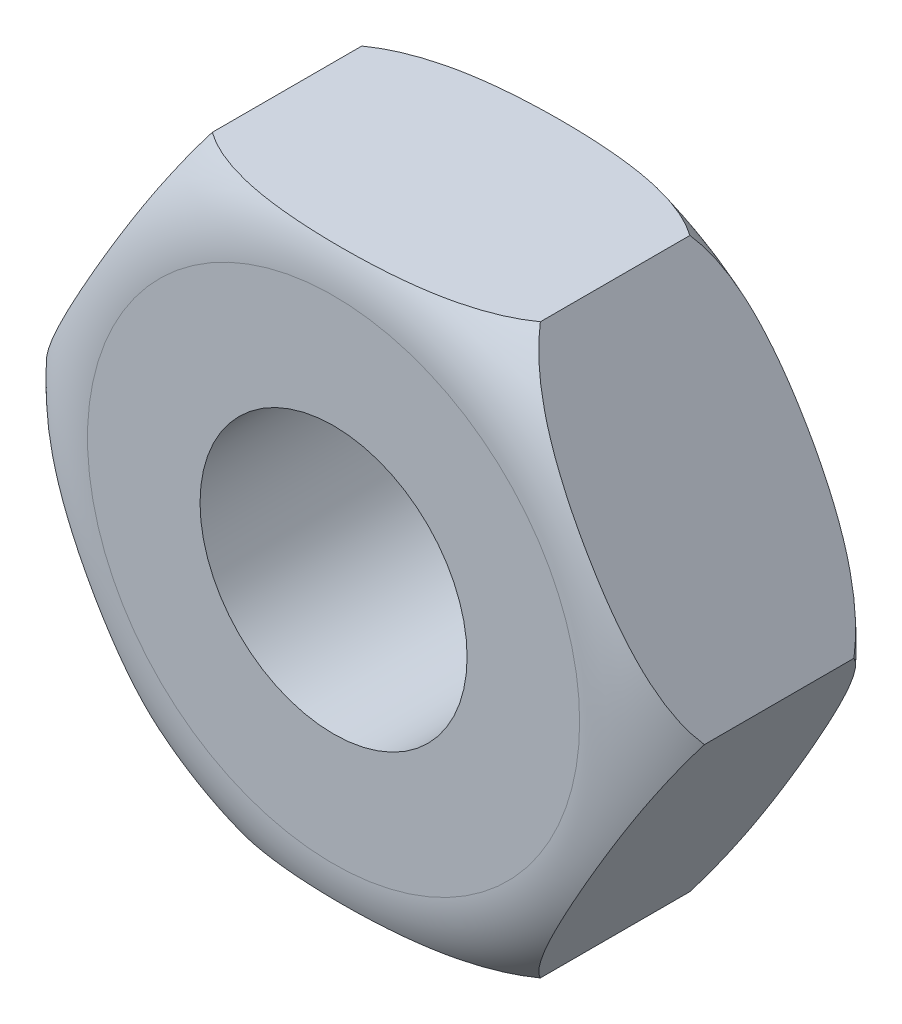
ISO-10303-21;
HEADER;
FILE_DESCRIPTION(('STEP AP214'),'2;1');
FILE_NAME('part.step','',(''),(''),'','','');
FILE_SCHEMA(('AUTOMOTIVE_DESIGN { 1 0 10303 214 1 1 1 1 }'));
ENDSEC;
DATA;
#1=APPLICATION_CONTEXT('core data for automotive mechanical design processes');
#2=APPLICATION_PROTOCOL_DEFINITION('international standard','automotive_design',2000,#1);
#3=PRODUCT_CONTEXT('',#1,'mechanical');
#4=PRODUCT('Part','Part','',(#3));
#5=PRODUCT_RELATED_PRODUCT_CATEGORY('part','',(#4));
#6=PRODUCT_DEFINITION_FORMATION('','',#4);
#7=PRODUCT_DEFINITION_CONTEXT('part definition',#1,'design');
#8=PRODUCT_DEFINITION('design','',#6,#7);
#9=PRODUCT_DEFINITION_SHAPE('','',#8);
#10=(LENGTH_UNIT() NAMED_UNIT(*) SI_UNIT(.MILLI.,.METRE.));
#11=(NAMED_UNIT(*) PLANE_ANGLE_UNIT() SI_UNIT($,.RADIAN.));
#12=(NAMED_UNIT(*) SI_UNIT($,.STERADIAN.) SOLID_ANGLE_UNIT());
#13=UNCERTAINTY_MEASURE_WITH_UNIT(LENGTH_MEASURE(1.E-05),#10,'distance_accuracy_value','');
#14=(GEOMETRIC_REPRESENTATION_CONTEXT(3) GLOBAL_UNCERTAINTY_ASSIGNED_CONTEXT((#13)) GLOBAL_UNIT_ASSIGNED_CONTEXT((#10,
#11,#12)) REPRESENTATION_CONTEXT('',''));
#15=CARTESIAN_POINT('',(0.,0.,0.));
#16=DIRECTION('',(0.,0.,1.));
#17=DIRECTION('',(1.,0.,0.));
#18=AXIS2_PLACEMENT_3D('',#15,#16,#17);
#19=CARTESIAN_POINT('',(1.53575171604441,2.66,1.1));
#20=DIRECTION('',(0.,-1.,0.));
#21=DIRECTION('',(1.,0.,0.));
#22=AXIS2_PLACEMENT_3D('',#19,#20,#21);
#23=PLANE('',#22);
#24=DIRECTION('',(0.,0.,1.));
#25=VECTOR('',#24,1.);
#26=CARTESIAN_POINT('',(1.53575171604441,2.66000000000001,1.1));
#27=LINE('',#26,#25);
#28=CARTESIAN_POINT('',(1.53575171604441,2.66000000000001,0.699999999999998));
#29=VERTEX_POINT('',#28);
#30=CARTESIAN_POINT('',(1.53575171604409,2.66,-0.700000000000907));
#31=VERTEX_POINT('',#30);
#32=EDGE_CURVE('E87',#29,#31,#27,.F.);
#33=ORIENTED_EDGE('',*,*,#32,.T.);
#34=CARTESIAN_POINT('',(-1.5357517160444,2.66000000000001,-0.699999999999992));
#35=CARTESIAN_POINT('',(-1.50290399525471,2.66,-0.723461220879989));
#36=CARTESIAN_POINT('',(-1.46879484420359,2.66000000000001,-0.745016689769943));
#37=CARTESIAN_POINT('',(-1.39874993443397,2.66000000000002,-0.784675349001222));
#38=CARTESIAN_POINT('',(-1.36282001483863,2.66000000000003,-0.80278878771447));
#39=CARTESIAN_POINT('',(-1.2542872586794,2.65999999999998,-0.852121478507863));
#40=CARTESIAN_POINT('',(-1.17977132831095,2.65999999999987,-0.879108495710288));
#41=CARTESIAN_POINT('',(-1.04058779351716,2.65999999999988,-0.920730231691807));
#42=CARTESIAN_POINT('',(-0.976279096277204,2.65999999999998,-0.936657457090459));
#43=CARTESIAN_POINT('',(-0.846599480630051,2.66000000000004,-0.963793268236621));
#44=CARTESIAN_POINT('',(-0.781227296072173,2.66000000000002,-0.974995725022728));
#45=CARTESIAN_POINT('',(-0.649923250688621,2.66,-0.993722584081293));
#46=CARTESIAN_POINT('',(-0.58399095126676,2.66000000000001,-1.00124376836121));
#47=CARTESIAN_POINT('',(-0.45063135488754,2.66000000000001,-1.01350908885374));
#48=CARTESIAN_POINT('',(-0.38319918971262,2.66000000000001,-1.01819856243552));
#49=CARTESIAN_POINT('',(-0.248283021400714,2.66000000000001,-1.0251435459277));
#50=CARTESIAN_POINT('',(-0.180799138204341,2.66000000000001,-1.02740149380815));
#51=CARTESIAN_POINT('',(-0.0458113474961082,2.66000000000001,-1.02978148886305));
#52=CARTESIAN_POINT('',(0.0216925518532716,2.66000000000001,-1.02990402663113));
#53=CARTESIAN_POINT('',(0.171145312613908,2.66000000000001,-1.02783832064106));
#54=CARTESIAN_POINT('',(0.253088068483589,2.66000000000001,-1.02514899150297));
#55=CARTESIAN_POINT('',(0.416819012266826,2.66000000000001,-1.0161481108264));
#56=CARTESIAN_POINT('',(0.498607129660076,2.66000000000001,-1.00983518403403));
#57=CARTESIAN_POINT('',(0.660307379728096,2.66,-0.992614623786173));
#58=CARTESIAN_POINT('',(0.740227717204882,2.66,-0.981787190156387));
#59=CARTESIAN_POINT('',(0.899005128540797,2.66,-0.953919442514121));
#60=CARTESIAN_POINT('',(0.977862844627615,2.66,-0.936883073393047));
#61=CARTESIAN_POINT('',(1.09765231592335,2.66,-0.90411003308647));
#62=CARTESIAN_POINT('',(1.13939702968187,2.66,-0.891358227779529));
#63=CARTESIAN_POINT('',(1.22184612662537,2.66,-0.862948593475944));
#64=CARTESIAN_POINT('',(1.2625516070615,2.66,-0.847293987050208));
#65=CARTESIAN_POINT('',(1.34335202365482,2.66,-0.812232274683742));
#66=CARTESIAN_POINT('',(1.38341692786636,2.66,-0.792754265070904));
#67=CARTESIAN_POINT('',(1.46142283524818,2.66,-0.749637749661709));
#68=CARTESIAN_POINT('',(1.49935520628148,2.66,-0.725983743706366));
#69=CARTESIAN_POINT('',(1.53575171604377,2.66,-0.70000000000046));
#70=B_SPLINE_CURVE_WITH_KNOTS('',3,(#34,#35,#36,#37,#38,#39,#40,#41,#42,#43,#44,#45,#46,#47,#48,
#49,#50,#51,#52,#53,#54,#55,#56,#57,#58,#59,#60,#61,#62,#63,#64,#65,#66,#67,#68,#69),
.UNSPECIFIED.,.F.,.F.,(4,2,2,2,2,2,2,2,2,2,2,2,2,2,2,2,2,4),(0.,0.120911176532311,
0.241456506656879,0.478392358296018,0.676965497449023,0.875795438913716,1.07479887896998,
1.27753030353216,1.48005826956299,1.68253970577883,1.92843496823723,2.17442361640137,
2.41621688503653,2.65785679565272,2.78871571448245,2.9194302195358,3.05284776873342,
3.18677135819851),.UNSPECIFIED.);
#71=CARTESIAN_POINT('',(-1.53575171604441,2.66,-0.700000000000001));
#72=VERTEX_POINT('',#71);
#73=EDGE_CURVE('E195',#72,#31,#70,.T.);
#74=ORIENTED_EDGE('',*,*,#73,.F.);
#75=DIRECTION('',(0.,0.,1.));
#76=VECTOR('',#75,1.);
#77=CARTESIAN_POINT('',(-1.53575171604441,2.66,1.1));
#78=LINE('',#77,#76);
#79=CARTESIAN_POINT('',(-1.53575171604441,2.66000000000001,0.699999999999996));
#80=VERTEX_POINT('',#79);
#81=EDGE_CURVE('E96',#72,#80,#78,.T.);
#82=ORIENTED_EDGE('',*,*,#81,.T.);
#83=CARTESIAN_POINT('',(1.53575171604441,2.66,0.700000000000005));
#84=CARTESIAN_POINT('',(1.50290399525471,2.65999999999999,0.723461220880001));
#85=CARTESIAN_POINT('',(1.46879484420359,2.65999999999999,0.745016689769955));
#86=CARTESIAN_POINT('',(1.39874993443397,2.66000000000001,0.784675349001232));
#87=CARTESIAN_POINT('',(1.36282001483863,2.66000000000002,0.802788787714479));
#88=CARTESIAN_POINT('',(1.2542872586794,2.65999999999997,0.852121478507871));
#89=CARTESIAN_POINT('',(1.17977132831095,2.65999999999986,0.879108495710295));
#90=CARTESIAN_POINT('',(1.04058779351716,2.65999999999988,0.920730231691812));
#91=CARTESIAN_POINT('',(0.976279096277203,2.65999999999997,0.936657457090465));
#92=CARTESIAN_POINT('',(0.846599480630044,2.66000000000004,0.963793268236626));
#93=CARTESIAN_POINT('',(0.781227296072163,2.66000000000001,0.974995725022733));
#94=CARTESIAN_POINT('',(0.649923250688607,2.66,0.993722584081297));
#95=CARTESIAN_POINT('',(0.583990951266743,2.66,1.00124376836121));
#96=CARTESIAN_POINT('',(0.450631354887517,2.66000000000001,1.01350908885375));
#97=CARTESIAN_POINT('',(0.383199189712594,2.66000000000001,1.01819856243552));
#98=CARTESIAN_POINT('',(0.248283021400683,2.66000000000001,1.02514354592771));
#99=CARTESIAN_POINT('',(0.180799138204306,2.66000000000001,1.02740149380815));
#100=CARTESIAN_POINT('',(0.045811347496068,2.66000000000001,1.02978148886305));
#101=CARTESIAN_POINT('',(-0.0216925518533147,2.66000000000001,1.02990402663113));
#102=CARTESIAN_POINT('',(-0.171145312613943,2.66000000000001,1.02783832064106));
#103=CARTESIAN_POINT('',(-0.253088068483614,2.66000000000001,1.02514899150297));
#104=CARTESIAN_POINT('',(-0.416819012266829,2.66000000000001,1.0161481108264));
#105=CARTESIAN_POINT('',(-0.498607129660069,2.66000000000001,1.00983518403403));
#106=CARTESIAN_POINT('',(-0.660307379728066,2.66000000000001,0.992614623786173));
#107=CARTESIAN_POINT('',(-0.740227717204841,2.66000000000001,0.981787190156389));
#108=CARTESIAN_POINT('',(-0.899005128540733,2.66000000000001,0.953919442514129));
#109=CARTESIAN_POINT('',(-0.97786284462754,2.66000000000001,0.936883073393059));
#110=CARTESIAN_POINT('',(-1.09765231592333,2.66000000000001,0.90411003308647));
#111=CARTESIAN_POINT('',(-1.13939702968192,2.66000000000001,0.891358227779507));
#112=CARTESIAN_POINT('',(-1.22184612662555,2.66000000000001,0.86294859347587));
#113=CARTESIAN_POINT('',(-1.26255160706174,2.66000000000001,0.847293987050103));
#114=CARTESIAN_POINT('',(-1.34335202365519,2.66000000000001,0.812232274683561));
#115=CARTESIAN_POINT('',(-1.38341692786679,2.66000000000001,0.792754265070678));
#116=CARTESIAN_POINT('',(-1.46142283524871,2.66000000000001,0.749637749661375));
#117=CARTESIAN_POINT('',(-1.49935520628207,2.66000000000001,0.72598374370597));
#118=CARTESIAN_POINT('',(-1.5357517160444,2.66000000000001,0.699999999999992));
#119=B_SPLINE_CURVE_WITH_KNOTS('',3,(#83,#84,#85,#86,#87,#88,#89,#90,#91,#92,#93,#94,#95,#96,
#97,#98,#99,#100,#101,#102,#103,#104,#105,#106,#107,#108,#109,#110,#111,#112,#113,#114,#115,
#116,#117,#118),.UNSPECIFIED.,.F.,.F.,(4,2,2,2,2,2,2,2,2,2,2,2,2,2,2,2,2,4),(0.,
0.120911176532311,0.241456506656879,0.478392358296017,0.67696549744903,0.87579543891373,
1.07479887897,1.27753030353219,1.48005826956303,1.68253970577887,1.92843496823725,
2.17442361640135,2.41621688503648,2.65785679565264,2.78871571448257,2.91943021953613,
3.05284776873398,3.18677135819929),.UNSPECIFIED.);
#120=EDGE_CURVE('E99',#29,#80,#119,.T.);
#121=ORIENTED_EDGE('',*,*,#120,.F.);
#122=EDGE_LOOP('',(#33,#74,#82,#121));
#123=FACE_BOUND('',#122,.T.);
#124=ADVANCED_FACE('F16',(#123),#23,.F.);
#125=CARTESIAN_POINT('',(3.07150343208882,0.,1.1));
#126=DIRECTION('',(-0.866025403784438,-0.500000000000001,0.));
#127=DIRECTION('',(0.500000000000001,-0.866025403784438,0.));
#128=AXIS2_PLACEMENT_3D('',#125,#126,#127);
#129=PLANE('',#128);
#130=DIRECTION('',(0.,0.,1.));
#131=VECTOR('',#130,1.);
#132=CARTESIAN_POINT('',(3.07150343208882,0.,1.1));
#133=LINE('',#132,#131);
#134=CARTESIAN_POINT('',(3.07150343208882,0.,0.699999999999998));
#135=VERTEX_POINT('',#134);
#136=CARTESIAN_POINT('',(3.07150343208882,0.,-0.699999999999996));
#137=VERTEX_POINT('',#136);
#138=EDGE_CURVE('E80',#135,#137,#133,.F.);
#139=ORIENTED_EDGE('',*,*,#138,.T.);
#140=CARTESIAN_POINT('',(1.53575171604474,2.65999999999945,-0.700000000000455));
#141=CARTESIAN_POINT('',(1.55217557643958,2.63155303933913,-0.723461220880426));
#142=CARTESIAN_POINT('',(1.56923015196515,2.60201364802733,-0.745016689770354));
#143=CARTESIAN_POINT('',(1.60425260684999,2.54135297676104,-0.784675349001585));
#144=CARTESIAN_POINT('',(1.62221756664766,2.51023675363555,-0.80278878771481));
#145=CARTESIAN_POINT('',(1.67648394472725,2.41624462965887,-0.852121478508144));
#146=CARTESIAN_POINT('',(1.71374190991138,2.3517119409731,-0.879108495710537));
#147=CARTESIAN_POINT('',(1.78333367730835,2.23117546405307,-0.920730231692033));
#148=CARTESIAN_POINT('',(1.81548802592846,2.17548249855894,-0.936657457090684));
#149=CARTESIAN_POINT('',(1.8803278337522,2.06317665705535,-0.963793268236835));
#150=CARTESIAN_POINT('',(1.91301392603117,2.00656268452724,-0.974995725022933));
#151=CARTESIAN_POINT('',(1.97866594872304,1.89285004560523,-0.993722584081475));
#152=CARTESIAN_POINT('',(2.01163209843403,1.83575099937589,-1.00124376836138));
#153=CARTESIAN_POINT('',(2.07831189662375,1.72025820107287,-1.01350908885388));
#154=CARTESIAN_POINT('',(2.11202797921126,1.66186023299911,-1.01819856243564));
#155=CARTESIAN_POINT('',(2.17948606336731,1.54501940385957,-1.02514354592779));
#156=CARTESIAN_POINT('',(2.21322800496555,1.4865766466654,-1.02740149380821));
#157=CARTESIAN_POINT('',(2.28072190031976,1.36967379071116,-1.02978148886307));
#158=CARTESIAN_POINT('',(2.3144738499945,1.31121369902,-1.02990402663112));
#159=CARTESIAN_POINT('',(2.38920023037466,1.18178381153585,-1.02783832064099));
#160=CARTESIAN_POINT('',(2.43017160830929,1.11081930329697,-1.02514899150289));
#161=CARTESIAN_POINT('',(2.51203708020048,0.969024146595819,-1.01614811082633));
#162=CARTESIAN_POINT('',(2.55293113889689,0.898193559205928,-1.00983518403398));
#163=CARTESIAN_POINT('',(2.63378126393049,0.758157034849448,-0.992614623786205));
#164=CARTESIAN_POINT('',(2.67374143266868,0.688943992315877,-0.981787190156484));
#165=CARTESIAN_POINT('',(2.75313013833624,0.551438720552535,-0.95391944251442));
#166=CARTESIAN_POINT('',(2.79255899637945,0.483145935137269,-0.936883073393482));
#167=CARTESIAN_POINT('',(2.85245373202726,0.379405209889352,-0.904110033087074));
#168=CARTESIAN_POINT('',(2.87332608890666,0.343253227300534,-0.891358227780098));
#169=CARTESIAN_POINT('',(2.91455063737866,0.27185021482793,-0.862948593476416));
#170=CARTESIAN_POINT('',(2.93490337759685,0.236598234696774,-0.847293987050617));
#171=CARTESIAN_POINT('',(2.97530358589377,0.166623021290154,-0.812232274683985));
#172=CARTESIAN_POINT('',(2.99533603799966,0.131925796442555,-0.792754265071042));
#173=CARTESIAN_POINT('',(3.03433899169081,0.0643706990042349,-0.749637749661585));
#174=CARTESIAN_POINT('',(3.05330517720757,0.0315203020634216,-0.725983743706085));
#175=CARTESIAN_POINT('',(3.07150343208882,0.,-0.699999999999991));
#176=B_SPLINE_CURVE_WITH_KNOTS('',3,(#140,#141,#142,#143,#144,#145,#146,#147,#148,#149,#150,
#151,#152,#153,#154,#155,#156,#157,#158,#159,#160,#161,#162,#163,#164,#165,#166,#167,#168,#169,
#170,#171,#172,#173,#174,#175),.UNSPECIFIED.,.F.,.F.,(4,2,2,2,2,2,2,2,2,2,2,2,2,2,2,2,2,4),(0.,
0.1209111765323,0.241456506656858,0.478392358295995,0.676965497449306,0.875795438914308,
1.07479887897088,1.27753030353337,1.4800582695645,1.68253970578063,1.92843496823777,
2.17442361640062,2.41621688503456,2.65785679564952,2.78871571448003,2.91943021953416,
3.05284776873259,3.18677135819849),.UNSPECIFIED.);
#177=EDGE_CURVE('E196',#31,#137,#176,.T.);
#178=ORIENTED_EDGE('',*,*,#177,.F.);
#179=ORIENTED_EDGE('',*,*,#32,.F.);
#180=CARTESIAN_POINT('',(3.07150343208882,0.,0.699999999999994));
#181=CARTESIAN_POINT('',(3.05507957169396,0.028446960660299,0.723461220879991));
#182=CARTESIAN_POINT('',(3.0380249961684,0.057986351972096,0.745016689769945));
#183=CARTESIAN_POINT('',(3.00300254128361,0.118647023238384,0.784675349001222));
#184=CARTESIAN_POINT('',(2.98503758148594,0.149763246363883,0.80278878771447));
#185=CARTESIAN_POINT('',(2.93077120340629,0.243755370340497,0.852121478507862));
#186=CARTESIAN_POINT('',(2.89351323822197,0.308288059026147,0.879108495710288));
#187=CARTESIAN_POINT('',(2.82392147082509,0.42882453594609,0.920730231691806));
#188=CARTESIAN_POINT('',(2.79176712220519,0.484517501440223,0.936657457090459));
#189=CARTESIAN_POINT('',(2.72692731438167,0.596823342943695,0.96379326823662));
#190=CARTESIAN_POINT('',(2.69424122210271,0.65343731547169,0.974995725022726));
#191=CARTESIAN_POINT('',(2.62858919941092,0.767149954393502,0.993722584081291));
#192=CARTESIAN_POINT('',(2.59562304969999,0.824249000622759,1.00124376836121));
#193=CARTESIAN_POINT('',(2.52894325151039,0.939741798925607,1.01350908885374));
#194=CARTESIAN_POINT('',(2.49522716892292,0.998139766999276,1.01819856243552));
#195=CARTESIAN_POINT('',(2.42776908476697,1.11498059613864,1.0251435459277));
#196=CARTESIAN_POINT('',(2.39402714316878,1.17342335333273,1.02740149380814));
#197=CARTESIAN_POINT('',(2.32653324781467,1.29032620928679,1.02978148886305));
#198=CARTESIAN_POINT('',(2.29278129813997,1.34878630097787,1.02990402663113));
#199=CARTESIAN_POINT('',(2.21805491775966,1.47821618846229,1.02783832064106));
#200=CARTESIAN_POINT('',(2.17708353982482,1.54918069670154,1.02514899150297));
#201=CARTESIAN_POINT('',(2.0952180679332,1.69097585340342,1.0161481108264));
#202=CARTESIAN_POINT('',(2.05432400923658,1.76180644079367,1.00983518403403));
#203=CARTESIAN_POINT('',(1.97347388420258,1.90184296515087,0.99261462378617));
#204=CARTESIAN_POINT('',(1.93351371546418,1.97105600768478,0.981787190156384));
#205=CARTESIAN_POINT('',(1.85412500979623,2.10856127944881,0.95391944251412));
#206=CARTESIAN_POINT('',(1.81469615175283,2.17685406486441,0.936883073393048));
#207=CARTESIAN_POINT('',(1.75480141610493,2.28059479011247,0.904110033086456));
#208=CARTESIAN_POINT('',(1.73392905922564,2.31674677270112,0.891358227779494));
#209=CARTESIAN_POINT('',(1.69270451075382,2.38814978517338,0.862948593475858));
#210=CARTESIAN_POINT('',(1.67235177053573,2.42340176530437,0.847293987050092));
#211=CARTESIAN_POINT('',(1.63195156223901,2.49337697871065,0.812232274683553));
#212=CARTESIAN_POINT('',(1.61191911013322,2.52807420355808,0.792754265070672));
#213=CARTESIAN_POINT('',(1.57291615644226,2.59562930099608,0.749637749661373));
#214=CARTESIAN_POINT('',(1.55394997092558,2.62847969793674,0.72598374370597));
#215=CARTESIAN_POINT('',(1.53575171604442,2.66,0.699999999999995));
#216=B_SPLINE_CURVE_WITH_KNOTS('',3,(#180,#181,#182,#183,#184,#185,#186,#187,#188,#189,#190,
#191,#192,#193,#194,#195,#196,#197,#198,#199,#200,#201,#202,#203,#204,#205,#206,#207,#208,#209,
#210,#211,#212,#213,#214,#215),.UNSPECIFIED.,.F.,.F.,(4,2,2,2,2,2,2,2,2,2,2,2,2,2,2,2,2,4),(0.,
0.120911176532311,0.241456506656879,0.478392358296018,0.676965497449024,0.875795438913718,
1.07479887896998,1.27753030353217,1.480058269563,1.68253970577884,1.92843496823723,
2.17442361640135,2.41621688503651,2.65785679565268,2.7887157144826,2.91943021953615,
3.05284776873398,3.18677135819928),.UNSPECIFIED.);
#217=EDGE_CURVE('E93',#135,#29,#216,.T.);
#218=ORIENTED_EDGE('',*,*,#217,.F.);
#219=EDGE_LOOP('',(#139,#178,#179,#218));
#220=FACE_BOUND('',#219,.T.);
#221=ADVANCED_FACE('F97',(#220),#129,.F.);
#222=CARTESIAN_POINT('',(1.53575171604441,-2.66,1.1));
#223=DIRECTION('',(-0.866025403784439,0.5,0.));
#224=DIRECTION('',(-0.5,-0.866025403784439,0.));
#225=AXIS2_PLACEMENT_3D('',#222,#223,#224);
#226=PLANE('',#225);
#227=DIRECTION('',(0.,0.,1.));
#228=VECTOR('',#227,1.);
#229=CARTESIAN_POINT('',(1.53575171604442,-2.66000000000002,1.1));
#230=LINE('',#229,#228);
#231=CARTESIAN_POINT('',(1.53575171604441,-2.66000000000002,0.699999999999991));
#232=VERTEX_POINT('',#231);
#233=CARTESIAN_POINT('',(1.53575171604441,-2.66000000000001,-0.700000000000001));
#234=VERTEX_POINT('',#233);
#235=EDGE_CURVE('E73',#232,#234,#230,.F.);
#236=ORIENTED_EDGE('',*,*,#235,.T.);
#237=CARTESIAN_POINT('',(3.07150343208882,0.,-0.699999999999999));
#238=CARTESIAN_POINT('',(3.05507957169396,-0.0284469606602837,-0.723461220879996));
#239=CARTESIAN_POINT('',(3.0380249961684,-0.0579863519720807,-0.74501668976995));
#240=CARTESIAN_POINT('',(3.0030025412836,-0.118647023238369,-0.784675349001227));
#241=CARTESIAN_POINT('',(2.98503758148594,-0.149763246363868,-0.802788787714475));
#242=CARTESIAN_POINT('',(2.93077120340629,-0.243755370340482,-0.852121478507866));
#243=CARTESIAN_POINT('',(2.89351323822196,-0.308288059026131,-0.879108495710292));
#244=CARTESIAN_POINT('',(2.82392147082508,-0.428824535946074,-0.920730231691811));
#245=CARTESIAN_POINT('',(2.79176712220518,-0.484517501440208,-0.936657457090463));
#246=CARTESIAN_POINT('',(2.72692731438167,-0.596823342943682,-0.963793268236624));
#247=CARTESIAN_POINT('',(2.69424122210271,-0.653437315471678,-0.974995725022731));
#248=CARTESIAN_POINT('',(2.62858919941091,-0.767149954393491,-0.993722584081295));
#249=CARTESIAN_POINT('',(2.59562304969999,-0.824249000622749,-1.00124376836121));
#250=CARTESIAN_POINT('',(2.52894325151038,-0.939741798925599,-1.01350908885375));
#251=CARTESIAN_POINT('',(2.49522716892292,-0.998139766999268,-1.01819856243552));
#252=CARTESIAN_POINT('',(2.42776908476696,-1.11498059613864,-1.02514354592771));
#253=CARTESIAN_POINT('',(2.39402714316877,-1.17342335333272,-1.02740149380815));
#254=CARTESIAN_POINT('',(2.32653324781466,-1.29032620928679,-1.02978148886305));
#255=CARTESIAN_POINT('',(2.29278129813997,-1.34878630097786,-1.02990402663113));
#256=CARTESIAN_POINT('',(2.21805491775965,-1.47821618846229,-1.02783832064106));
#257=CARTESIAN_POINT('',(2.17708353982481,-1.54918069670153,-1.02514899150297));
#258=CARTESIAN_POINT('',(2.0952180679332,-1.69097585340341,-1.0161481108264));
#259=CARTESIAN_POINT('',(2.05432400923657,-1.76180644079367,-1.00983518403403));
#260=CARTESIAN_POINT('',(1.97347388420257,-1.90184296515086,-0.992614623786174));
#261=CARTESIAN_POINT('',(1.93351371546418,-1.97105600768478,-0.981787190156389));
#262=CARTESIAN_POINT('',(1.85412500979623,-2.1085612794488,-0.953919442514125));
#263=CARTESIAN_POINT('',(1.81469615175282,-2.1768540648644,-0.936883073393053));
#264=CARTESIAN_POINT('',(1.75480141610493,-2.28059479011246,-0.904110033086462));
#265=CARTESIAN_POINT('',(1.73392905922563,-2.31674677270111,-0.891358227779501));
#266=CARTESIAN_POINT('',(1.69270451075382,-2.38814978517337,-0.862948593475865));
#267=CARTESIAN_POINT('',(1.67235177053573,-2.42340176530436,-0.847293987050099));
#268=CARTESIAN_POINT('',(1.63195156223901,-2.49337697871064,-0.812232274683561));
#269=CARTESIAN_POINT('',(1.61191911013321,-2.52807420355808,-0.792754265070679));
#270=CARTESIAN_POINT('',(1.57291615644225,-2.59562930099607,-0.749637749661381));
#271=CARTESIAN_POINT('',(1.55394997092558,-2.62847969793673,-0.725983743705979));
#272=CARTESIAN_POINT('',(1.53575171604441,-2.66,-0.700000000000003));
#273=B_SPLINE_CURVE_WITH_KNOTS('',3,(#237,#238,#239,#240,#241,#242,#243,#244,#245,#246,#247,
#248,#249,#250,#251,#252,#253,#254,#255,#256,#257,#258,#259,#260,#261,#262,#263,#264,#265,#266,
#267,#268,#269,#270,#271,#272),.UNSPECIFIED.,.F.,.F.,(4,2,2,2,2,2,2,2,2,2,2,2,2,2,2,2,2,4),(0.,
0.120911176532311,0.241456506656879,0.478392358296017,0.676965497449025,0.875795438913721,
1.07479887896999,1.27753030353218,1.48005826956301,1.68253970577885,1.92843496823724,
2.17442361640136,2.41621688503651,2.65785679565269,2.78871571448261,2.91943021953616,
3.05284776873399,3.18677135819929),.UNSPECIFIED.);
#274=EDGE_CURVE('E83',#137,#234,#273,.T.);
#275=ORIENTED_EDGE('',*,*,#274,.F.);
#276=ORIENTED_EDGE('',*,*,#138,.F.);
#277=CARTESIAN_POINT('',(1.53575171604441,-2.66,0.700000000000002));
#278=CARTESIAN_POINT('',(1.55217557643924,-2.6315530393397,0.723461220879999));
#279=CARTESIAN_POINT('',(1.56923015196481,-2.60201364802791,0.745016689769953));
#280=CARTESIAN_POINT('',(1.60425260684963,-2.54135297676164,0.784675349001231));
#281=CARTESIAN_POINT('',(1.62221756664731,-2.51023675363614,0.802788787714478));
#282=CARTESIAN_POINT('',(1.67648394472689,-2.41624462965949,0.852121478507869));
#283=CARTESIAN_POINT('',(1.71374190991101,-2.35171194097373,0.879108495710294));
#284=CARTESIAN_POINT('',(1.78333367730792,-2.2311754640538,0.920730231691812));
#285=CARTESIAN_POINT('',(1.81548802592798,-2.17548249855975,0.936657457090465));
#286=CARTESIAN_POINT('',(1.88032783375162,-2.06317665705635,0.963793268236626));
#287=CARTESIAN_POINT('',(1.91301392603054,-2.00656268452833,0.974995725022733));
#288=CARTESIAN_POINT('',(1.9786659487223,-1.89285004560649,0.993722584081297));
#289=CARTESIAN_POINT('',(2.01163209843324,-1.83575099937724,1.00124376836121));
#290=CARTESIAN_POINT('',(2.07831189662285,-1.7202582010744,1.01350908885375));
#291=CARTESIAN_POINT('',(2.11202797921031,-1.66186023300072,1.01819856243552));
#292=CARTESIAN_POINT('',(2.17948606336627,-1.54501940386135,1.02514354592771));
#293=CARTESIAN_POINT('',(2.21322800496446,-1.48657664666727,1.02740149380815));
#294=CARTESIAN_POINT('',(2.28072190031857,-1.3696737907132,1.02978148886305));
#295=CARTESIAN_POINT('',(2.31447384999327,-1.31121369902213,1.02990402663113));
#296=CARTESIAN_POINT('',(2.38920023037358,-1.1817838115377,1.02783832064106));
#297=CARTESIAN_POINT('',(2.43017160830842,-1.11081930329846,1.02514899150297));
#298=CARTESIAN_POINT('',(2.51203708020003,-0.969024146596586,1.0161481108264));
#299=CARTESIAN_POINT('',(2.55293113889665,-0.898193559206333,1.00983518403403));
#300=CARTESIAN_POINT('',(2.63378126393065,-0.758157034849147,0.992614623786174));
#301=CARTESIAN_POINT('',(2.67374143266904,-0.688943992315231,0.98178719015639));
#302=CARTESIAN_POINT('',(2.75313013833699,-0.551438720551213,0.953919442514128));
#303=CARTESIAN_POINT('',(2.79255899638039,-0.483145935135615,0.936883073393057));
#304=CARTESIAN_POINT('',(2.85245373202829,-0.379405209887554,0.904110033086467));
#305=CARTESIAN_POINT('',(2.87332608890758,-0.343253227298906,0.891358227779505));
#306=CARTESIAN_POINT('',(2.9145506373794,-0.271850214826638,0.862948593475869));
#307=CARTESIAN_POINT('',(2.93490337759749,-0.236598234695648,0.847293987050102));
#308=CARTESIAN_POINT('',(2.97530358589421,-0.166623021289361,0.812232274683561));
#309=CARTESIAN_POINT('',(2.99533603800001,-0.131925796441927,0.792754265070679));
#310=CARTESIAN_POINT('',(3.03433899169097,-0.0643706990039249,0.749637749661378));
#311=CARTESIAN_POINT('',(3.05330517720765,-0.0315203020632642,0.725983743705974));
#312=CARTESIAN_POINT('',(3.07150343208882,0.,0.699999999999997));
#313=B_SPLINE_CURVE_WITH_KNOTS('',3,(#277,#278,#279,#280,#281,#282,#283,#284,#285,#286,#287,
#288,#289,#290,#291,#292,#293,#294,#295,#296,#297,#298,#299,#300,#301,#302,#303,#304,#305,#306,
#307,#308,#309,#310,#311,#312),.UNSPECIFIED.,.F.,.F.,(4,2,2,2,2,2,2,2,2,2,2,2,2,2,2,2,2,4),(0.,
0.120911176532311,0.241456506656879,0.478392358296017,0.676965497449028,0.875795438913726,
1.07479887896999,1.27753030353219,1.48005826956302,1.68253970577887,1.92843496823725,
2.17442361640136,2.4162168850365,2.65785679565266,2.78871571448259,2.91943021953615,
3.05284776873399,3.18677135819929),.UNSPECIFIED.);
#314=EDGE_CURVE('E20',#232,#135,#313,.T.);
#315=ORIENTED_EDGE('',*,*,#314,.F.);
#316=EDGE_LOOP('',(#236,#275,#276,#315));
#317=FACE_BOUND('',#316,.T.);
#318=ADVANCED_FACE('F82',(#317),#226,.F.);
#319=CARTESIAN_POINT('',(-1.53575171604441,-2.66,1.1));
#320=DIRECTION('',(0.,1.,0.));
#321=DIRECTION('',(-1.,0.,0.));
#322=AXIS2_PLACEMENT_3D('',#319,#320,#321);
#323=PLANE('',#322);
#324=DIRECTION('',(0.,0.,1.));
#325=VECTOR('',#324,1.);
#326=CARTESIAN_POINT('',(-1.53575171604442,-2.65999999999998,1.1));
#327=LINE('',#326,#325);
#328=CARTESIAN_POINT('',(-1.53575171604442,-2.65999999999999,0.700000000000007));
#329=VERTEX_POINT('',#328);
#330=CARTESIAN_POINT('',(-1.53575171604443,-2.65999999999999,-0.699999999999995));
#331=VERTEX_POINT('',#330);
#332=EDGE_CURVE('E147',#329,#331,#327,.F.);
#333=ORIENTED_EDGE('',*,*,#332,.T.);
#334=CARTESIAN_POINT('',(1.53575171604441,-2.66000000000002,-0.699999999999982));
#335=CARTESIAN_POINT('',(1.50290399525471,-2.66000000000001,-0.723461220879979));
#336=CARTESIAN_POINT('',(1.46879484420359,-2.66000000000001,-0.745016689769934));
#337=CARTESIAN_POINT('',(1.39874993443397,-2.66000000000003,-0.784675349001213));
#338=CARTESIAN_POINT('',(1.36282001483863,-2.66000000000003,-0.802788787714461));
#339=CARTESIAN_POINT('',(1.2542872586794,-2.65999999999999,-0.852121478507855));
#340=CARTESIAN_POINT('',(1.17977132831096,-2.65999999999988,-0.879108495710282));
#341=CARTESIAN_POINT('',(1.04058779351717,-2.65999999999989,-0.920730231691801));
#342=CARTESIAN_POINT('',(0.976279096277215,-2.65999999999998,-0.936657457090453));
#343=CARTESIAN_POINT('',(0.846599480630066,-2.66000000000005,-0.963793268236615));
#344=CARTESIAN_POINT('',(0.78122729607219,-2.66000000000002,-0.974995725022722));
#345=CARTESIAN_POINT('',(0.649923250688643,-2.66000000000001,-0.993722584081287));
#346=CARTESIAN_POINT('',(0.583990951266785,-2.66000000000001,-1.0012437683612));
#347=CARTESIAN_POINT('',(0.450631354887568,-2.66000000000002,-1.01350908885374));
#348=CARTESIAN_POINT('',(0.38319918971265,-2.66000000000001,-1.01819856243552));
#349=CARTESIAN_POINT('',(0.248283021400748,-2.66000000000001,-1.0251435459277));
#350=CARTESIAN_POINT('',(0.180799138204377,-2.66000000000001,-1.02740149380814));
#351=CARTESIAN_POINT('',(0.0458113474961478,-2.66000000000001,-1.02978148886305));
#352=CARTESIAN_POINT('',(-0.0216925518532301,-2.66000000000001,-1.02990402663113));
#353=CARTESIAN_POINT('',(-0.171145312613873,-2.66000000000001,-1.02783832064106));
#354=CARTESIAN_POINT('',(-0.253088068483562,-2.66000000000001,-1.02514899150297));
#355=CARTESIAN_POINT('',(-0.416819012266816,-2.66000000000001,-1.0161481108264));
#356=CARTESIAN_POINT('',(-0.498607129660075,-2.66000000000001,-1.00983518403403));
#357=CARTESIAN_POINT('',(-0.660307379728109,-2.66000000000001,-0.99261462378617));
#358=CARTESIAN_POINT('',(-0.740227717204903,-2.66000000000001,-0.981787190156383));
#359=CARTESIAN_POINT('',(-0.89900512854083,-2.66,-0.953919442514113));
#360=CARTESIAN_POINT('',(-0.977862844627655,-2.66,-0.936883073393037));
#361=CARTESIAN_POINT('',(-1.09765231592345,-2.66,-0.904110033086439));
#362=CARTESIAN_POINT('',(-1.13939702968203,-2.66,-0.891358227779478));
#363=CARTESIAN_POINT('',(-1.22184612662565,-2.66,-0.862948593475843));
#364=CARTESIAN_POINT('',(-1.26255160706183,-2.66,-0.847293987050077));
#365=CARTESIAN_POINT('',(-1.34335202365526,-2.66,-0.812232274683539));
#366=CARTESIAN_POINT('',(-1.38341692786685,-2.66,-0.792754265070659));
#367=CARTESIAN_POINT('',(-1.46142283524876,-2.66,-0.749637749661362));
#368=CARTESIAN_POINT('',(-1.4993552062821,-2.66,-0.725983743705962));
#369=CARTESIAN_POINT('',(-1.53575171604443,-2.66,-0.699999999999989));
#370=B_SPLINE_CURVE_WITH_KNOTS('',3,(#334,#335,#336,#337,#338,#339,#340,#341,#342,#343,#344,
#345,#346,#347,#348,#349,#350,#351,#352,#353,#354,#355,#356,#357,#358,#359,#360,#361,#362,#363,
#364,#365,#366,#367,#368,#369),.UNSPECIFIED.,.F.,.F.,(4,2,2,2,2,2,2,2,2,2,2,2,2,2,2,2,2,4),(0.,
0.120911176532311,0.24145650665688,0.478392358296018,0.676965497449016,0.875795438913702,
1.07479887896996,1.27753030353214,1.48005826956296,1.68253970577879,1.92843496823722,
2.17442361640138,2.41621688503657,2.65785679565278,2.78871571448268,2.91943021953622,
3.05284776873404,3.18677135819932),.UNSPECIFIED.);
#371=EDGE_CURVE('E164',#234,#331,#370,.T.);
#372=ORIENTED_EDGE('',*,*,#371,.F.);
#373=ORIENTED_EDGE('',*,*,#235,.F.);
#374=CARTESIAN_POINT('',(-1.53575171604443,-2.66,0.69999999999999));
#375=CARTESIAN_POINT('',(-1.50290399525474,-2.65999999999999,0.723461220879986));
#376=CARTESIAN_POINT('',(-1.46879484420361,-2.65999999999999,0.745016689769941));
#377=CARTESIAN_POINT('',(-1.39874993443399,-2.66000000000001,0.784675349001219));
#378=CARTESIAN_POINT('',(-1.36282001483865,-2.66000000000002,0.802788787714468));
#379=CARTESIAN_POINT('',(-1.25428725867942,-2.65999999999997,0.852121478507861));
#380=CARTESIAN_POINT('',(-1.17977132831098,-2.65999999999986,0.879108495710286));
#381=CARTESIAN_POINT('',(-1.04058779351719,-2.65999999999988,0.920730231691805));
#382=CARTESIAN_POINT('',(-0.976279096277234,-2.65999999999997,0.936657457090457));
#383=CARTESIAN_POINT('',(-0.846599480630081,-2.66000000000004,0.963793268236619));
#384=CARTESIAN_POINT('',(-0.781227296072204,-2.66000000000001,0.974995725022726));
#385=CARTESIAN_POINT('',(-0.649923250688654,-2.66,0.99372258408129));
#386=CARTESIAN_POINT('',(-0.583990951266794,-2.66,1.00124376836121));
#387=CARTESIAN_POINT('',(-0.450631354887574,-2.66000000000001,1.01350908885374));
#388=CARTESIAN_POINT('',(-0.383199189712655,-2.66000000000001,1.01819856243552));
#389=CARTESIAN_POINT('',(-0.24828302140075,-2.66000000000001,1.0251435459277));
#390=CARTESIAN_POINT('',(-0.180799138204376,-2.66000000000001,1.02740149380814));
#391=CARTESIAN_POINT('',(-0.0458113474961445,-2.66000000000001,1.02978148886305));
#392=CARTESIAN_POINT('',(0.021692551853235,-2.66000000000001,1.02990402663113));
#393=CARTESIAN_POINT('',(0.171145312613873,-2.66000000000001,1.02783832064106));
#394=CARTESIAN_POINT('',(0.253088068483555,-2.66000000000001,1.02514899150297));
#395=CARTESIAN_POINT('',(0.416819012266795,-2.66000000000001,1.0161481108264));
#396=CARTESIAN_POINT('',(0.498607129660047,-2.66000000000001,1.00983518403403));
#397=CARTESIAN_POINT('',(0.660307379728068,-2.66000000000002,0.992614623786171));
#398=CARTESIAN_POINT('',(0.740227717204855,-2.66000000000002,0.981787190156385));
#399=CARTESIAN_POINT('',(0.89900512854077,-2.66000000000002,0.953919442514118));
#400=CARTESIAN_POINT('',(0.977862844627588,-2.66000000000002,0.936883073393044));
#401=CARTESIAN_POINT('',(1.09765231592338,-2.66000000000002,0.904110033086449));
#402=CARTESIAN_POINT('',(1.13939702968197,-2.66000000000002,0.891358227779487));
#403=CARTESIAN_POINT('',(1.22184612662559,-2.66000000000002,0.86294859347585));
#404=CARTESIAN_POINT('',(1.26255160706178,-2.66000000000002,0.847293987050083));
#405=CARTESIAN_POINT('',(1.34335202365521,-2.66000000000002,0.812232274683543));
#406=CARTESIAN_POINT('',(1.38341692786681,-2.66000000000002,0.792754265070661));
#407=CARTESIAN_POINT('',(1.46142283524873,-2.66000000000002,0.749637749661361));
#408=CARTESIAN_POINT('',(1.49935520628208,-2.66000000000002,0.725983743705958));
#409=CARTESIAN_POINT('',(1.53575171604441,-2.66000000000002,0.699999999999982));
#410=B_SPLINE_CURVE_WITH_KNOTS('',3,(#374,#375,#376,#377,#378,#379,#380,#381,#382,#383,#384,
#385,#386,#387,#388,#389,#390,#391,#392,#393,#394,#395,#396,#397,#398,#399,#400,#401,#402,#403,
#404,#405,#406,#407,#408,#409),.UNSPECIFIED.,.F.,.F.,(4,2,2,2,2,2,2,2,2,2,2,2,2,2,2,2,2,4),(0.,
0.120911176532311,0.24145650665688,0.478392358296019,0.676965497449021,0.875795438913712,
1.07479887896997,1.27753030353216,1.48005826956298,1.68253970577882,1.92843496823723,
2.17442361640137,2.41621688503654,2.65785679565273,2.78871571448264,2.91943021953619,
3.05284776873403,3.18677135819932),.UNSPECIFIED.);
#411=EDGE_CURVE('E95',#329,#232,#410,.T.);
#412=ORIENTED_EDGE('',*,*,#411,.F.);
#413=EDGE_LOOP('',(#333,#372,#373,#412));
#414=FACE_BOUND('',#413,.T.);
#415=ADVANCED_FACE('F173',(#414),#323,.F.);
#416=CARTESIAN_POINT('',(-3.07150343208882,0.,1.1));
#417=DIRECTION('',(0.866025403784438,0.5,0.));
#418=DIRECTION('',(-0.5,0.866025403784438,0.));
#419=AXIS2_PLACEMENT_3D('',#416,#417,#418);
#420=PLANE('',#419);
#421=DIRECTION('',(0.,0.,1.));
#422=VECTOR('',#421,1.);
#423=CARTESIAN_POINT('',(-3.07150343208881,0.,1.1));
#424=LINE('',#423,#422);
#425=CARTESIAN_POINT('',(-3.07150343208881,0.,0.700000000000001));
#426=VERTEX_POINT('',#425);
#427=CARTESIAN_POINT('',(-3.07150343208881,0.,-0.699999999999998));
#428=VERTEX_POINT('',#427);
#429=EDGE_CURVE('E145',#426,#428,#424,.F.);
#430=ORIENTED_EDGE('',*,*,#429,.T.);
#431=CARTESIAN_POINT('',(-1.53575171604441,-2.65999999999999,-0.700000000000014));
#432=CARTESIAN_POINT('',(-1.55217557643925,-2.63155303933969,-0.723461220880011));
#433=CARTESIAN_POINT('',(-1.56923015196482,-2.6020136480279,-0.745016689769964));
#434=CARTESIAN_POINT('',(-1.60425260684964,-2.54135297676162,-0.78467534900124));
#435=CARTESIAN_POINT('',(-1.62221756664732,-2.51023675363613,-0.802788787714486));
#436=CARTESIAN_POINT('',(-1.67648394472689,-2.41624462965948,-0.852121478507876));
#437=CARTESIAN_POINT('',(-1.71374190991102,-2.35171194097371,-0.879108495710301));
#438=CARTESIAN_POINT('',(-1.78333367730793,-2.23117546405378,-0.920730231691818));
#439=CARTESIAN_POINT('',(-1.81548802592799,-2.17548249855974,-0.936657457090471));
#440=CARTESIAN_POINT('',(-1.88032783375163,-2.06317665705632,-0.963793268236631));
#441=CARTESIAN_POINT('',(-1.91301392603055,-2.0065626845283,-0.974995725022738));
#442=CARTESIAN_POINT('',(-1.97866594872232,-1.89285004560646,-0.993722584081302));
#443=CARTESIAN_POINT('',(-2.01163209843325,-1.83575099937721,-1.00124376836122));
#444=CARTESIAN_POINT('',(-2.07831189662287,-1.72025820107436,-1.01350908885375));
#445=CARTESIAN_POINT('',(-2.11202797921033,-1.66186023300068,-1.01819856243553));
#446=CARTESIAN_POINT('',(-2.17948606336629,-1.54501940386131,-1.02514354592771));
#447=CARTESIAN_POINT('',(-2.21322800496448,-1.48657664666722,-1.02740149380815));
#448=CARTESIAN_POINT('',(-2.2807219003186,-1.36967379071315,-1.02978148886305));
#449=CARTESIAN_POINT('',(-2.31447384999329,-1.31121369902207,-1.02990402663113));
#450=CARTESIAN_POINT('',(-2.38920023037361,-1.18178381153765,-1.02783832064106));
#451=CARTESIAN_POINT('',(-2.43017160830844,-1.11081930329842,-1.02514899150297));
#452=CARTESIAN_POINT('',(-2.51203708020004,-0.969024146596567,-1.0161481108264));
#453=CARTESIAN_POINT('',(-2.55293113889665,-0.898193559206324,-1.00983518403403));
#454=CARTESIAN_POINT('',(-2.63378126393065,-0.758157034849155,-0.992614623786176));
#455=CARTESIAN_POINT('',(-2.67374143266903,-0.688943992315248,-0.981787190156393));
#456=CARTESIAN_POINT('',(-2.75313013833697,-0.551438720551246,-0.953919442514136));
#457=CARTESIAN_POINT('',(-2.79255899638037,-0.483145935135655,-0.936883073393069));
#458=CARTESIAN_POINT('',(-2.85245373202826,-0.379405209887597,-0.904110033086483));
#459=CARTESIAN_POINT('',(-2.87332608890756,-0.343253227298946,-0.891358227779521));
#460=CARTESIAN_POINT('',(-2.91455063737938,-0.27185021482667,-0.862948593475883));
#461=CARTESIAN_POINT('',(-2.93490337759747,-0.236598234695676,-0.847293987050115));
#462=CARTESIAN_POINT('',(-2.9753035858942,-0.16662302128938,-0.812232274683572));
#463=CARTESIAN_POINT('',(-2.995336038,-0.131925796441941,-0.792754265070687));
#464=CARTESIAN_POINT('',(-3.03433899169097,-0.0643706990039313,-0.749637749661382));
#465=CARTESIAN_POINT('',(-3.05330517720765,-0.0315203020632665,-0.725983743705976));
#466=CARTESIAN_POINT('',(-3.07150343208882,0.,-0.699999999999996));
#467=B_SPLINE_CURVE_WITH_KNOTS('',3,(#431,#432,#433,#434,#435,#436,#437,#438,#439,#440,#441,
#442,#443,#444,#445,#446,#447,#448,#449,#450,#451,#452,#453,#454,#455,#456,#457,#458,#459,#460,
#461,#462,#463,#464,#465,#466),.UNSPECIFIED.,.F.,.F.,(4,2,2,2,2,2,2,2,2,2,2,2,2,2,2,2,2,4),(0.,
0.120911176532311,0.241456506656878,0.478392358296017,0.676965497449035,0.875795438913742,
1.07479887897002,1.27753030353222,1.48005826956306,1.68253970577891,1.92843496823726,
2.17442361640134,2.41621688503645,2.65785679565259,2.78871571448253,2.9194302195361,
3.05284776873396,3.18677135819928),.UNSPECIFIED.);
#468=EDGE_CURVE('E40',#331,#428,#467,.T.);
#469=ORIENTED_EDGE('',*,*,#468,.F.);
#470=ORIENTED_EDGE('',*,*,#332,.F.);
#471=CARTESIAN_POINT('',(-3.07150343208882,0.,0.699999999999997));
#472=CARTESIAN_POINT('',(-3.05507957169396,-0.0284469606602809,0.723461220879994));
#473=CARTESIAN_POINT('',(-3.0380249961684,-0.0579863519720777,0.745016689769948));
#474=CARTESIAN_POINT('',(-3.0030025412836,-0.118647023238365,0.784675349001226));
#475=CARTESIAN_POINT('',(-2.98503758148594,-0.149763246363865,0.802788787714474));
#476=CARTESIAN_POINT('',(-2.93077120340629,-0.243755370340478,0.852121478507866));
#477=CARTESIAN_POINT('',(-2.89351323822197,-0.308288059026129,0.879108495710291));
#478=CARTESIAN_POINT('',(-2.82392147082509,-0.428824535946072,0.92073023169181));
#479=CARTESIAN_POINT('',(-2.79176712220519,-0.484517501440205,0.936657457090463));
#480=CARTESIAN_POINT('',(-2.72692731438167,-0.596823342943678,0.963793268236624));
#481=CARTESIAN_POINT('',(-2.69424122210271,-0.653437315471674,0.974995725022731));
#482=CARTESIAN_POINT('',(-2.62858919941091,-0.767149954393487,0.993722584081295));
#483=CARTESIAN_POINT('',(-2.59562304969999,-0.824249000622744,1.00124376836121));
#484=CARTESIAN_POINT('',(-2.52894325151038,-0.939741798925593,1.01350908885375));
#485=CARTESIAN_POINT('',(-2.49522716892292,-0.998139766999262,1.01819856243552));
#486=CARTESIAN_POINT('',(-2.42776908476696,-1.11498059613863,1.02514354592771));
#487=CARTESIAN_POINT('',(-2.39402714316878,-1.17342335333271,1.02740149380815));
#488=CARTESIAN_POINT('',(-2.32653324781466,-1.29032620928678,1.02978148886305));
#489=CARTESIAN_POINT('',(-2.29278129813997,-1.34878630097785,1.02990402663113));
#490=CARTESIAN_POINT('',(-2.21805491775965,-1.47821618846228,1.02783832064106));
#491=CARTESIAN_POINT('',(-2.17708353982481,-1.54918069670153,1.02514899150297));
#492=CARTESIAN_POINT('',(-2.0952180679332,-1.69097585340341,1.0161481108264));
#493=CARTESIAN_POINT('',(-2.05432400923657,-1.76180644079367,1.00983518403403));
#494=CARTESIAN_POINT('',(-1.97347388420257,-1.90184296515086,0.992614623786174));
#495=CARTESIAN_POINT('',(-1.93351371546417,-1.97105600768478,0.981787190156389));
#496=CARTESIAN_POINT('',(-1.85412500979622,-2.10856127944881,0.953919442514125));
#497=CARTESIAN_POINT('',(-1.81469615175281,-2.17685406486441,0.936883073393052));
#498=CARTESIAN_POINT('',(-1.75480141610492,-2.28059479011247,0.90411003308646));
#499=CARTESIAN_POINT('',(-1.73392905922563,-2.31674677270112,0.891358227779499));
#500=CARTESIAN_POINT('',(-1.69270451075382,-2.38814978517338,0.862948593475865));
#501=CARTESIAN_POINT('',(-1.67235177053572,-2.42340176530436,0.8472939870501));
#502=CARTESIAN_POINT('',(-1.63195156223901,-2.49337697871064,0.812232274683563));
#503=CARTESIAN_POINT('',(-1.61191911013321,-2.52807420355807,0.792754265070683));
#504=CARTESIAN_POINT('',(-1.57291615644225,-2.59562930099607,0.749637749661388));
#505=CARTESIAN_POINT('',(-1.55394997092558,-2.62847969793672,0.725983743705988));
#506=CARTESIAN_POINT('',(-1.53575171604441,-2.65999999999999,0.700000000000015));
#507=B_SPLINE_CURVE_WITH_KNOTS('',3,(#471,#472,#473,#474,#475,#476,#477,#478,#479,#480,#481,
#482,#483,#484,#485,#486,#487,#488,#489,#490,#491,#492,#493,#494,#495,#496,#497,#498,#499,#500,
#501,#502,#503,#504,#505,#506),.UNSPECIFIED.,.F.,.F.,(4,2,2,2,2,2,2,2,2,2,2,2,2,2,2,2,2,4),(0.,
0.120911176532311,0.241456506656879,0.478392358296018,0.676965497449026,0.875795438913721,
1.07479887896999,1.27753030353217,1.48005826956301,1.68253970577885,1.92843496823725,
2.17442361640137,2.41621688503653,2.65785679565271,2.78871571448262,2.91943021953616,
3.05284776873399,3.18677135819927),.UNSPECIFIED.);
#508=EDGE_CURVE('E178',#426,#329,#507,.T.);
#509=ORIENTED_EDGE('',*,*,#508,.F.);
#510=EDGE_LOOP('',(#430,#469,#470,#509));
#511=FACE_BOUND('',#510,.T.);
#512=ADVANCED_FACE('F170',(#511),#420,.F.);
#513=CARTESIAN_POINT('',(-1.53575171604441,2.66,1.1));
#514=DIRECTION('',(0.866025403784438,-0.5,0.));
#515=DIRECTION('',(0.5,0.866025403784438,0.));
#516=AXIS2_PLACEMENT_3D('',#513,#514,#515);
#517=PLANE('',#516);
#518=ORIENTED_EDGE('',*,*,#81,.F.);
#519=CARTESIAN_POINT('',(-3.07150343208881,0.,-0.700000000000003));
#520=CARTESIAN_POINT('',(-3.05507957169395,0.0284469606602919,-0.723461220879999));
#521=CARTESIAN_POINT('',(-3.0380249961684,0.0579863519720889,-0.745016689769953));
#522=CARTESIAN_POINT('',(-3.0030025412836,0.118647023238377,-0.78467534900123));
#523=CARTESIAN_POINT('',(-2.98503758148594,0.149763246363876,-0.802788787714477));
#524=CARTESIAN_POINT('',(-2.93077120340628,0.24375537034049,-0.852121478507869));
#525=CARTESIAN_POINT('',(-2.89351323822196,0.308288059026141,-0.879108495710294));
#526=CARTESIAN_POINT('',(-2.82392147082508,0.428824535946085,-0.920730231691812));
#527=CARTESIAN_POINT('',(-2.79176712220518,0.484517501440219,-0.936657457090464));
#528=CARTESIAN_POINT('',(-2.72692731438166,0.596823342943693,-0.963793268236626));
#529=CARTESIAN_POINT('',(-2.6942412221027,0.65343731547169,-0.974995725022733));
#530=CARTESIAN_POINT('',(-2.62858919941091,0.767149954393505,-0.993722584081297));
#531=CARTESIAN_POINT('',(-2.59562304969998,0.824249000622764,-1.00124376836121));
#532=CARTESIAN_POINT('',(-2.52894325151037,0.939741798925614,-1.01350908885375));
#533=CARTESIAN_POINT('',(-2.49522716892291,0.998139766999285,-1.01819856243552));
#534=CARTESIAN_POINT('',(-2.42776908476695,1.11498059613866,-1.02514354592771));
#535=CARTESIAN_POINT('',(-2.39402714316877,1.17342335333274,-1.02740149380815));
#536=CARTESIAN_POINT('',(-2.32653324781465,1.29032620928681,-1.02978148886305));
#537=CARTESIAN_POINT('',(-2.29278129813996,1.34878630097788,-1.02990402663113));
#538=CARTESIAN_POINT('',(-2.21805491775964,1.47821618846231,-1.02783832064106));
#539=CARTESIAN_POINT('',(-2.1770835398248,1.54918069670155,-1.02514899150297));
#540=CARTESIAN_POINT('',(-2.09521806793319,1.69097585340342,-1.0161481108264));
#541=CARTESIAN_POINT('',(-2.05432400923657,1.76180644079367,-1.00983518403403));
#542=CARTESIAN_POINT('',(-1.97347388420257,1.90184296515086,-0.992614623786174));
#543=CARTESIAN_POINT('',(-1.93351371546418,1.97105600768477,-0.98178719015639));
#544=CARTESIAN_POINT('',(-1.85412500979623,2.10856127944879,-0.953919442514128));
#545=CARTESIAN_POINT('',(-1.81469615175283,2.17685406486439,-0.936883073393056));
#546=CARTESIAN_POINT('',(-1.75480141610493,2.28059479011245,-0.904110033086467));
#547=CARTESIAN_POINT('',(-1.73392905922564,2.3167467727011,-0.891358227779506));
#548=CARTESIAN_POINT('',(-1.69270451075383,2.38814978517336,-0.86294859347587));
#549=CARTESIAN_POINT('',(-1.67235177053573,2.42340176530435,-0.847293987050104));
#550=CARTESIAN_POINT('',(-1.63195156223901,2.49337697871064,-0.812232274683564));
#551=CARTESIAN_POINT('',(-1.61191911013321,2.52807420355807,-0.792754265070682));
#552=CARTESIAN_POINT('',(-1.57291615644225,2.59562930099607,-0.749637749661382));
#553=CARTESIAN_POINT('',(-1.55394997092558,2.62847969793673,-0.725983743705979));
#554=CARTESIAN_POINT('',(-1.53575171604441,2.66,-0.700000000000003));
#555=B_SPLINE_CURVE_WITH_KNOTS('',3,(#519,#520,#521,#522,#523,#524,#525,#526,#527,#528,#529,
#530,#531,#532,#533,#534,#535,#536,#537,#538,#539,#540,#541,#542,#543,#544,#545,#546,#547,#548,
#549,#550,#551,#552,#553,#554),.UNSPECIFIED.,.F.,.F.,(4,2,2,2,2,2,2,2,2,2,2,2,2,2,2,2,2,4),(0.,
0.120911176532311,0.241456506656879,0.478392358296017,0.676965497449028,0.875795438913726,
1.07479887896999,1.27753030353219,1.48005826956302,1.68253970577887,1.92843496823725,
2.17442361640135,2.4162168850365,2.65785679565266,2.78871571448258,2.91943021953614,
3.05284776873398,3.18677135819928),.UNSPECIFIED.);
#556=EDGE_CURVE('E155',#428,#72,#555,.T.);
#557=ORIENTED_EDGE('',*,*,#556,.F.);
#558=ORIENTED_EDGE('',*,*,#429,.F.);
#559=CARTESIAN_POINT('',(-1.53575171604441,2.66,0.700000000000002));
#560=CARTESIAN_POINT('',(-1.55217557643924,2.6315530393397,0.723461220879999));
#561=CARTESIAN_POINT('',(-1.56923015196481,2.60201364802791,0.745016689769952));
#562=CARTESIAN_POINT('',(-1.60425260684963,2.54135297676164,0.78467534900123));
#563=CARTESIAN_POINT('',(-1.62221756664731,2.51023675363615,0.802788787714478));
#564=CARTESIAN_POINT('',(-1.67648394472689,2.41624462965949,0.85212147850787));
#565=CARTESIAN_POINT('',(-1.71374190991101,2.35171194097373,0.879108495710294));
#566=CARTESIAN_POINT('',(-1.78333367730792,2.2311754640538,0.920730231691812));
#567=CARTESIAN_POINT('',(-1.81548802592798,2.17548249855975,0.936657457090465));
#568=CARTESIAN_POINT('',(-1.88032783375162,2.06317665705635,0.963793268236626));
#569=CARTESIAN_POINT('',(-1.91301392603054,2.00656268452832,0.974995725022733));
#570=CARTESIAN_POINT('',(-1.9786659487223,1.89285004560649,0.993722584081297));
#571=CARTESIAN_POINT('',(-2.01163209843324,1.83575099937724,1.00124376836121));
#572=CARTESIAN_POINT('',(-2.07831189662286,1.72025820107439,1.01350908885375));
#573=CARTESIAN_POINT('',(-2.11202797921031,1.66186023300072,1.01819856243552));
#574=CARTESIAN_POINT('',(-2.17948606336627,1.54501940386135,1.02514354592771));
#575=CARTESIAN_POINT('',(-2.21322800496446,1.48657664666727,1.02740149380815));
#576=CARTESIAN_POINT('',(-2.28072190031858,1.3696737907132,1.02978148886305));
#577=CARTESIAN_POINT('',(-2.31447384999327,1.31121369902212,1.02990402663113));
#578=CARTESIAN_POINT('',(-2.38920023037358,1.1817838115377,1.02783832064106));
#579=CARTESIAN_POINT('',(-2.43017160830842,1.11081930329846,1.02514899150297));
#580=CARTESIAN_POINT('',(-2.51203708020003,0.969024146596586,1.0161481108264));
#581=CARTESIAN_POINT('',(-2.55293113889665,0.898193559206335,1.00983518403403));
#582=CARTESIAN_POINT('',(-2.63378126393065,0.758157034849149,0.992614623786174));
#583=CARTESIAN_POINT('',(-2.67374143266904,0.688943992315234,0.981787190156389));
#584=CARTESIAN_POINT('',(-2.75313013833699,0.551438720551216,0.953919442514128));
#585=CARTESIAN_POINT('',(-2.79255899638039,0.483145935135619,0.936883073393058));
#586=CARTESIAN_POINT('',(-2.85245373202829,0.379405209887559,0.904110033086468));
#587=CARTESIAN_POINT('',(-2.87332608890758,0.343253227298911,0.891358227779506));
#588=CARTESIAN_POINT('',(-2.9145506373794,0.271850214826645,0.86294859347587));
#589=CARTESIAN_POINT('',(-2.93490337759749,0.236598234695656,0.847293987050104));
#590=CARTESIAN_POINT('',(-2.97530358589421,0.166623021289369,0.812232274683564));
#591=CARTESIAN_POINT('',(-2.99533603800001,0.131925796441935,0.792754265070682));
#592=CARTESIAN_POINT('',(-3.03433899169097,0.0643706990039345,0.749637749661382));
#593=CARTESIAN_POINT('',(-3.05330517720765,0.031520302063274,0.725983743705979));
#594=CARTESIAN_POINT('',(-3.07150343208881,0.,0.700000000000003));
#595=B_SPLINE_CURVE_WITH_KNOTS('',3,(#559,#560,#561,#562,#563,#564,#565,#566,#567,#568,#569,
#570,#571,#572,#573,#574,#575,#576,#577,#578,#579,#580,#581,#582,#583,#584,#585,#586,#587,#588,
#589,#590,#591,#592,#593,#594),.UNSPECIFIED.,.F.,.F.,(4,2,2,2,2,2,2,2,2,2,2,2,2,2,2,2,2,4),(0.,
0.120911176532311,0.241456506656879,0.478392358296018,0.676965497449029,0.875795438913728,
1.07479887897,1.27753030353219,1.48005826956303,1.68253970577887,1.92843496823725,
2.17442361640136,2.4162168850365,2.65785679565266,2.78871571448258,2.91943021953614,
3.05284776873398,3.18677135819928),.UNSPECIFIED.);
#596=EDGE_CURVE('E100',#80,#426,#595,.T.);
#597=ORIENTED_EDGE('',*,*,#596,.F.);
#598=EDGE_LOOP('',(#518,#557,#558,#597));
#599=FACE_BOUND('',#598,.T.);
#600=ADVANCED_FACE('F116',(#599),#517,.F.);
#601=CARTESIAN_POINT('',(0.,0.,0.162958333333328));
#602=DIRECTION('',(0.,0.,1.));
#603=DIRECTION('',(1.,0.,0.));
#604=AXIS2_PLACEMENT_3D('',#601,#602,#603);
#605=TOROIDAL_SURFACE('',#604,2.30362757406661,0.937041666666672);
#606=CARTESIAN_POINT('',(0.,0.,1.1));
#607=DIRECTION('',(0.,0.,-1.));
#608=DIRECTION('',(1.,0.,0.));
#609=AXIS2_PLACEMENT_3D('',#606,#607,#608);
#610=CIRCLE('',#609,2.30362757406661);
#611=CARTESIAN_POINT('',(2.30362757406661,0.,1.1));
#612=VERTEX_POINT('',#611);
#613=EDGE_CURVE('E134',#612,#612,#610,.F.);
#614=ORIENTED_EDGE('',*,*,#613,.F.);
#615=EDGE_LOOP('',(#614));
#616=FACE_BOUND('',#615,.T.);
#617=ORIENTED_EDGE('',*,*,#508,.T.);
#618=ORIENTED_EDGE('',*,*,#411,.T.);
#619=ORIENTED_EDGE('',*,*,#314,.T.);
#620=ORIENTED_EDGE('',*,*,#217,.T.);
#621=ORIENTED_EDGE('',*,*,#120,.T.);
#622=ORIENTED_EDGE('',*,*,#596,.T.);
#623=EDGE_LOOP('',(#617,#618,#619,#620,#621,#622));
#624=FACE_BOUND('',#623,.T.);
#625=ADVANCED_FACE('F92',(#616,#624),#605,.T.);
#626=CARTESIAN_POINT('',(0.,0.,-0.162958333333328));
#627=DIRECTION('',(0.,0.,1.));
#628=DIRECTION('',(1.,0.,0.));
#629=AXIS2_PLACEMENT_3D('',#626,#627,#628);
#630=TOROIDAL_SURFACE('',#629,2.30362757406661,0.937041666666672);
#631=ORIENTED_EDGE('',*,*,#468,.T.);
#632=ORIENTED_EDGE('',*,*,#556,.T.);
#633=ORIENTED_EDGE('',*,*,#73,.T.);
#634=ORIENTED_EDGE('',*,*,#177,.T.);
#635=ORIENTED_EDGE('',*,*,#274,.T.);
#636=ORIENTED_EDGE('',*,*,#371,.T.);
#637=EDGE_LOOP('',(#631,#632,#633,#634,#635,#636));
#638=FACE_BOUND('',#637,.T.);
#639=CARTESIAN_POINT('',(0.,0.,-1.1));
#640=DIRECTION('',(0.,0.,1.));
#641=DIRECTION('',(1.,0.,0.));
#642=AXIS2_PLACEMENT_3D('',#639,#640,#641);
#643=CIRCLE('',#642,2.30362757406661);
#644=CARTESIAN_POINT('',(2.30362757406661,0.,-1.1));
#645=VERTEX_POINT('',#644);
#646=EDGE_CURVE('E154',#645,#645,#643,.T.);
#647=ORIENTED_EDGE('',*,*,#646,.T.);
#648=EDGE_LOOP('',(#647));
#649=FACE_BOUND('',#648,.T.);
#650=ADVANCED_FACE('F115',(#638,#649),#630,.T.);
#651=CARTESIAN_POINT('',(0.,0.,1.1));
#652=DIRECTION('',(0.,0.,1.));
#653=DIRECTION('',(1.,0.,0.));
#654=AXIS2_PLACEMENT_3D('',#651,#652,#653);
#655=PLANE('',#654);
#656=ORIENTED_EDGE('',*,*,#613,.T.);
#657=EDGE_LOOP('',(#656));
#658=FACE_BOUND('',#657,.T.);
#659=CARTESIAN_POINT('',(0.,0.,1.1));
#660=DIRECTION('',(0.,0.,1.));
#661=DIRECTION('',(1.,0.,0.));
#662=AXIS2_PLACEMENT_3D('',#659,#660,#661);
#663=CIRCLE('',#662,1.25);
#664=CARTESIAN_POINT('',(1.25,0.,1.1));
#665=VERTEX_POINT('',#664);
#666=EDGE_CURVE('E31',#665,#665,#663,.F.);
#667=ORIENTED_EDGE('',*,*,#666,.T.);
#668=EDGE_LOOP('',(#667));
#669=FACE_BOUND('',#668,.T.);
#670=ADVANCED_FACE('F224',(#658,#669),#655,.T.);
#671=CARTESIAN_POINT('',(0.,0.,-1.1));
#672=DIRECTION('',(0.,0.,1.));
#673=DIRECTION('',(1.,0.,0.));
#674=AXIS2_PLACEMENT_3D('',#671,#672,#673);
#675=PLANE('',#674);
#676=ORIENTED_EDGE('',*,*,#646,.F.);
#677=EDGE_LOOP('',(#676));
#678=FACE_BOUND('',#677,.T.);
#679=CARTESIAN_POINT('',(0.,0.,-1.1));
#680=DIRECTION('',(0.,0.,1.));
#681=DIRECTION('',(1.,0.,0.));
#682=AXIS2_PLACEMENT_3D('',#679,#680,#681);
#683=CIRCLE('',#682,1.25);
#684=CARTESIAN_POINT('',(1.25,0.,-1.1));
#685=VERTEX_POINT('',#684);
#686=EDGE_CURVE('E11',#685,#685,#683,.T.);
#687=ORIENTED_EDGE('',*,*,#686,.T.);
#688=EDGE_LOOP('',(#687));
#689=FACE_BOUND('',#688,.T.);
#690=ADVANCED_FACE('F218',(#678,#689),#675,.F.);
#691=CARTESIAN_POINT('',(0.,0.,4.80962041219149));
#692=DIRECTION('',(0.,0.,1.));
#693=DIRECTION('',(1.,0.,0.));
#694=AXIS2_PLACEMENT_3D('',#691,#692,#693);
#695=CYLINDRICAL_SURFACE('',#694,1.25);
#696=ORIENTED_EDGE('',*,*,#686,.F.);
#697=EDGE_LOOP('',(#696));
#698=FACE_BOUND('',#697,.T.);
#699=ORIENTED_EDGE('',*,*,#666,.F.);
#700=EDGE_LOOP('',(#699));
#701=FACE_BOUND('',#700,.T.);
#702=ADVANCED_FACE('F216',(#698,#701),#695,.F.);
#703=CLOSED_SHELL('',(#124,#221,#318,#415,#512,#600,#625,#650,#670,#690,#702));
#704=MANIFOLD_SOLID_BREP('B1',#703);
#705=ADVANCED_BREP_SHAPE_REPRESENTATION('',(#18,#704),#14);
#706=SHAPE_DEFINITION_REPRESENTATION(#9,#705);
ENDSEC;
END-ISO-10303-21;
